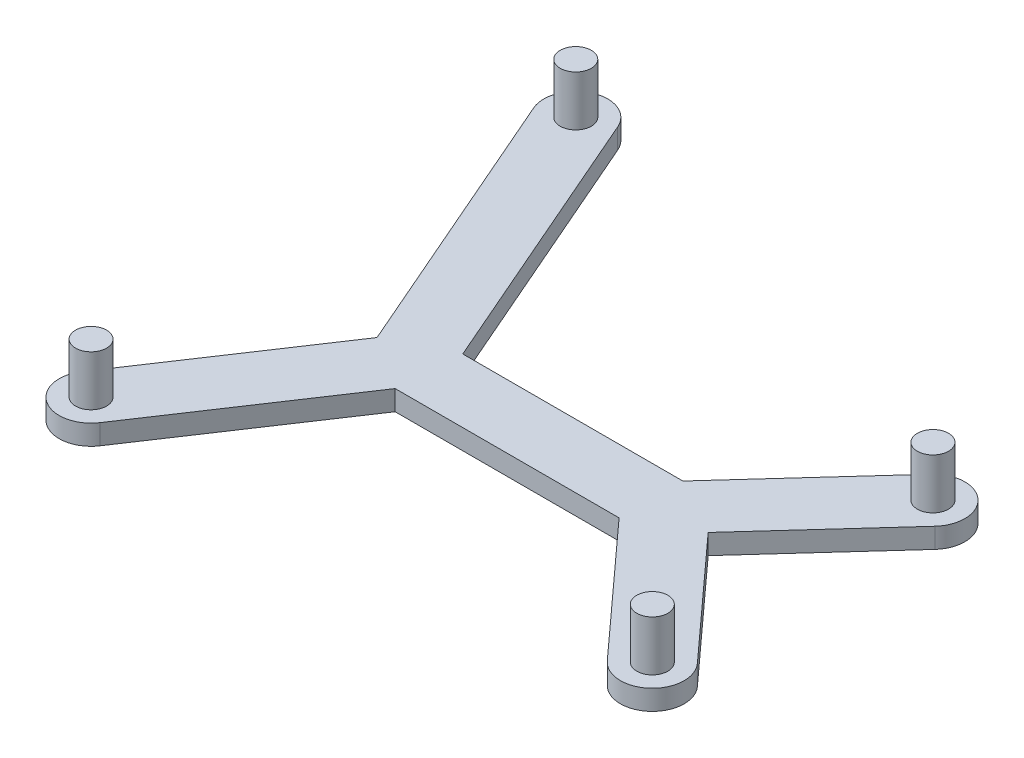
ISO-10303-21;
HEADER;
FILE_DESCRIPTION(('STEP AP214'),'2;1');
FILE_NAME('part.step','',(''),(''),'','','');
FILE_SCHEMA(('AUTOMOTIVE_DESIGN { 1 0 10303 214 1 1 1 1 }'));
ENDSEC;
DATA;
#1=APPLICATION_CONTEXT('core data for automotive mechanical design processes');
#2=APPLICATION_PROTOCOL_DEFINITION('international standard','automotive_design',2000,#1);
#3=PRODUCT_CONTEXT('',#1,'mechanical');
#4=PRODUCT('Part','Part','',(#3));
#5=PRODUCT_RELATED_PRODUCT_CATEGORY('part','',(#4));
#6=PRODUCT_DEFINITION_FORMATION('','',#4);
#7=PRODUCT_DEFINITION_CONTEXT('part definition',#1,'design');
#8=PRODUCT_DEFINITION('design','',#6,#7);
#9=PRODUCT_DEFINITION_SHAPE('','',#8);
#10=(LENGTH_UNIT() NAMED_UNIT(*) SI_UNIT(.MILLI.,.METRE.));
#11=(NAMED_UNIT(*) PLANE_ANGLE_UNIT() SI_UNIT($,.RADIAN.));
#12=(NAMED_UNIT(*) SI_UNIT($,.STERADIAN.) SOLID_ANGLE_UNIT());
#13=UNCERTAINTY_MEASURE_WITH_UNIT(LENGTH_MEASURE(1.E-05),#10,'distance_accuracy_value','');
#14=(GEOMETRIC_REPRESENTATION_CONTEXT(3) GLOBAL_UNCERTAINTY_ASSIGNED_CONTEXT((#13)) GLOBAL_UNIT_ASSIGNED_CONTEXT((#10,
#11,#12)) REPRESENTATION_CONTEXT('',''));
#15=CARTESIAN_POINT('',(0.,0.,0.));
#16=DIRECTION('',(0.,0.,1.));
#17=DIRECTION('',(1.,0.,0.));
#18=AXIS2_PLACEMENT_3D('',#15,#16,#17);
#19=CARTESIAN_POINT('',(11.0517762398185,-2.,-10.047069308926));
#20=DIRECTION('',(-0.739940073395943,0.,0.672672793996313));
#21=DIRECTION('',(0.672672793996313,0.,0.739940073395943));
#22=AXIS2_PLACEMENT_3D('',#19,#20,#21);
#23=PLANE('',#22);
#24=DIRECTION('',(0.672672793996313,0.,0.739940073395943));
#25=VECTOR('',#24,1.);
#26=CARTESIAN_POINT('',(11.0517762398185,0.,-10.047069308926));
#27=LINE('',#26,#25);
#28=CARTESIAN_POINT('',(51.9354756115694,0.,34.925));
#29=VERTEX_POINT('',#28);
#30=CARTESIAN_POINT('',(63.6906902669679,0.,47.8557361209383));
#31=VERTEX_POINT('',#30);
#32=EDGE_CURVE('E234',#29,#31,#27,.T.);
#33=ORIENTED_EDGE('',*,*,#32,.F.);
#34=DIRECTION('',(0.,1.,0.));
#35=VECTOR('',#34,1.);
#36=CARTESIAN_POINT('',(51.9354756115694,-2.,34.925));
#37=LINE('',#36,#35);
#38=CARTESIAN_POINT('',(51.9354756115694,-2.,34.925));
#39=VERTEX_POINT('',#38);
#40=EDGE_CURVE('E13',#39,#29,#37,.T.);
#41=ORIENTED_EDGE('',*,*,#40,.F.);
#42=DIRECTION('',(0.672672793996313,0.,0.739940073395943));
#43=VECTOR('',#42,1.);
#44=CARTESIAN_POINT('',(11.0517762398185,-2.,-10.047069308926));
#45=LINE('',#44,#43);
#46=CARTESIAN_POINT('',(63.6906902669679,-2.,47.8557361209383));
#47=VERTEX_POINT('',#46);
#48=EDGE_CURVE('E286',#39,#47,#45,.T.);
#49=ORIENTED_EDGE('',*,*,#48,.T.);
#50=DIRECTION('',(0.,1.,0.));
#51=VECTOR('',#50,1.);
#52=CARTESIAN_POINT('',(63.6906902669679,-2.,47.8557361209383));
#53=LINE('',#52,#51);
#54=EDGE_CURVE('E98',#47,#31,#53,.T.);
#55=ORIENTED_EDGE('',*,*,#54,.T.);
#56=EDGE_LOOP('',(#33,#41,#49,#55));
#57=FACE_BOUND('',#56,.T.);
#58=ADVANCED_FACE('F95',(#57),#23,.T.);
#59=CARTESIAN_POINT('',(0.,-2.,34.925));
#60=DIRECTION('',(0.,0.,1.));
#61=DIRECTION('',(1.,0.,0.));
#62=AXIS2_PLACEMENT_3D('',#59,#60,#61);
#63=PLANE('',#62);
#64=DIRECTION('',(1.,0.,0.));
#65=VECTOR('',#64,1.);
#66=CARTESIAN_POINT('',(0.,0.,34.925));
#67=LINE('',#66,#65);
#68=CARTESIAN_POINT('',(29.6392084331994,0.,34.925));
#69=VERTEX_POINT('',#68);
#70=EDGE_CURVE('E283',#69,#29,#67,.T.);
#71=ORIENTED_EDGE('',*,*,#70,.F.);
#72=DIRECTION('',(0.,1.,0.));
#73=VECTOR('',#72,1.);
#74=CARTESIAN_POINT('',(29.6392084331994,-2.,34.925));
#75=LINE('',#74,#73);
#76=CARTESIAN_POINT('',(29.6392084331994,-2.,34.925));
#77=VERTEX_POINT('',#76);
#78=EDGE_CURVE('E105',#77,#69,#75,.T.);
#79=ORIENTED_EDGE('',*,*,#78,.F.);
#80=DIRECTION('',(1.,0.,0.));
#81=VECTOR('',#80,1.);
#82=CARTESIAN_POINT('',(0.,-2.,34.925));
#83=LINE('',#82,#81);
#84=EDGE_CURVE('E211',#77,#39,#83,.T.);
#85=ORIENTED_EDGE('',*,*,#84,.T.);
#86=ORIENTED_EDGE('',*,*,#40,.T.);
#87=EDGE_LOOP('',(#71,#79,#85,#86));
#88=FACE_BOUND('',#87,.T.);
#89=ADVANCED_FACE('F326',(#88),#63,.T.);
#90=CARTESIAN_POINT('',(36.6386827614457,-2.,24.4257885076305));
#91=DIRECTION('',(-0.832050294337844,0.,-0.554700196225229));
#92=DIRECTION('',(-0.554700196225229,0.,0.832050294337844));
#93=AXIS2_PLACEMENT_3D('',#90,#91,#92);
#94=PLANE('',#93);
#95=DIRECTION('',(-0.554700196225229,0.,0.832050294337844));
#96=VECTOR('',#95,1.);
#97=CARTESIAN_POINT('',(36.6386827614457,0.,24.4257885076305));
#98=LINE('',#97,#96);
#99=CARTESIAN_POINT('',(17.8817596845227,0.,52.5611731230151));
#100=VERTEX_POINT('',#99);
#101=EDGE_CURVE('E216',#69,#100,#98,.T.);
#102=ORIENTED_EDGE('',*,*,#101,.T.);
#103=DIRECTION('',(0.,1.,0.));
#104=VECTOR('',#103,1.);
#105=CARTESIAN_POINT('',(17.8817596845227,-2.,52.5611731230151));
#106=LINE('',#105,#104);
#107=CARTESIAN_POINT('',(17.8817596845227,-2.,52.5611731230151));
#108=VERTEX_POINT('',#107);
#109=EDGE_CURVE('E214',#108,#100,#106,.T.);
#110=ORIENTED_EDGE('',*,*,#109,.F.);
#111=DIRECTION('',(-0.554700196225229,0.,0.832050294337844));
#112=VECTOR('',#111,1.);
#113=CARTESIAN_POINT('',(36.6386827614457,-2.,24.4257885076305));
#114=LINE('',#113,#112);
#115=EDGE_CURVE('E204',#77,#108,#114,.T.);
#116=ORIENTED_EDGE('',*,*,#115,.F.);
#117=ORIENTED_EDGE('',*,*,#78,.T.);
#118=EDGE_LOOP('',(#102,#110,#116,#117));
#119=FACE_BOUND('',#118,.T.);
#120=ADVANCED_FACE('F215',(#119),#94,.F.);
#121=CARTESIAN_POINT('',(15.24,-2.,50.8));
#122=DIRECTION('',(0.,1.,0.));
#123=DIRECTION('',(0.,0.,1.));
#124=AXIS2_PLACEMENT_3D('',#121,#122,#123);
#125=CYLINDRICAL_SURFACE('',#124,3.175);
#126=CARTESIAN_POINT('',(15.24,0.,50.8));
#127=DIRECTION('',(0.,1.,0.));
#128=DIRECTION('',(0.,0.,1.));
#129=AXIS2_PLACEMENT_3D('',#126,#127,#128);
#130=CIRCLE('',#129,3.175);
#131=CARTESIAN_POINT('',(12.5982403154774,0.,49.0388268769849));
#132=VERTEX_POINT('',#131);
#133=EDGE_CURVE('E278',#132,#100,#130,.T.);
#134=ORIENTED_EDGE('',*,*,#133,.F.);
#135=DIRECTION('',(0.,1.,0.));
#136=VECTOR('',#135,1.);
#137=CARTESIAN_POINT('',(12.5982403154774,-2.,49.0388268769849));
#138=LINE('',#137,#136);
#139=CARTESIAN_POINT('',(12.5982403154774,-2.,49.0388268769849));
#140=VERTEX_POINT('',#139);
#141=EDGE_CURVE('E221',#140,#132,#138,.T.);
#142=ORIENTED_EDGE('',*,*,#141,.F.);
#143=CARTESIAN_POINT('',(15.24,-2.,50.8));
#144=DIRECTION('',(0.,1.,0.));
#145=DIRECTION('',(0.,0.,1.));
#146=AXIS2_PLACEMENT_3D('',#143,#144,#145);
#147=CIRCLE('',#146,3.175);
#148=EDGE_CURVE('E209',#140,#108,#147,.T.);
#149=ORIENTED_EDGE('',*,*,#148,.T.);
#150=ORIENTED_EDGE('',*,*,#109,.T.);
#151=EDGE_LOOP('',(#134,#142,#149,#150));
#152=FACE_BOUND('',#151,.T.);
#153=ADVANCED_FACE('F223',(#152),#125,.T.);
#154=CARTESIAN_POINT('',(31.3551633924004,-2.,20.9034422616003));
#155=DIRECTION('',(-0.832050294337843,0.,-0.554700196225229));
#156=DIRECTION('',(-0.554700196225229,0.,0.832050294337844));
#157=AXIS2_PLACEMENT_3D('',#154,#155,#156);
#158=PLANE('',#157);
#159=DIRECTION('',(-0.554700196225229,0.,0.832050294337844));
#160=VECTOR('',#159,1.);
#161=CARTESIAN_POINT('',(31.3551633924004,0.,20.9034422616003));
#162=LINE('',#161,#160);
#163=CARTESIAN_POINT('',(24.3382441738607,0.,31.4288210894098));
#164=VERTEX_POINT('',#163);
#165=EDGE_CURVE('E274',#164,#132,#162,.T.);
#166=ORIENTED_EDGE('',*,*,#165,.F.);
#167=DIRECTION('',(0.,1.,0.));
#168=VECTOR('',#167,1.);
#169=CARTESIAN_POINT('',(24.3382441738607,-2.,31.4288210894098));
#170=LINE('',#169,#168);
#171=CARTESIAN_POINT('',(24.3382441738607,-2.,31.4288210894098));
#172=VERTEX_POINT('',#171);
#173=EDGE_CURVE('E292',#172,#164,#170,.T.);
#174=ORIENTED_EDGE('',*,*,#173,.F.);
#175=DIRECTION('',(-0.554700196225229,0.,0.832050294337844));
#176=VECTOR('',#175,1.);
#177=CARTESIAN_POINT('',(31.3551633924004,-2.,20.9034422616003));
#178=LINE('',#177,#176);
#179=EDGE_CURVE('E225',#172,#140,#178,.T.);
#180=ORIENTED_EDGE('',*,*,#179,.T.);
#181=ORIENTED_EDGE('',*,*,#141,.T.);
#182=EDGE_LOOP('',(#166,#174,#180,#181));
#183=FACE_BOUND('',#182,.T.);
#184=ADVANCED_FACE('F339',(#183),#158,.T.);
#185=CARTESIAN_POINT('',(8.97663325502078,-2.,-3.90288402392208));
#186=DIRECTION('',(-0.917070056253235,0.,0.39872611141445));
#187=DIRECTION('',(0.39872611141445,0.,0.917070056253235));
#188=AXIS2_PLACEMENT_3D('',#185,#186,#187);
#189=PLANE('',#188);
#190=DIRECTION('',(0.39872611141445,0.,0.917070056253235));
#191=VECTOR('',#190,1.);
#192=CARTESIAN_POINT('',(8.97663325502078,0.,-3.90288402392208));
#193=LINE('',#192,#191);
#194=CARTESIAN_POINT('',(12.328302571396,0.,3.80595540374088));
#195=VERTEX_POINT('',#194);
#196=EDGE_CURVE('E270',#195,#164,#193,.T.);
#197=ORIENTED_EDGE('',*,*,#196,.F.);
#198=DIRECTION('',(0.,1.,0.));
#199=VECTOR('',#198,1.);
#200=CARTESIAN_POINT('',(12.328302571396,-2.,3.80595540374088));
#201=LINE('',#200,#199);
#202=CARTESIAN_POINT('',(12.328302571396,-2.,3.80595540374088));
#203=VERTEX_POINT('',#202);
#204=EDGE_CURVE('E295',#203,#195,#201,.T.);
#205=ORIENTED_EDGE('',*,*,#204,.F.);
#206=DIRECTION('',(0.39872611141445,0.,0.917070056253235));
#207=VECTOR('',#206,1.);
#208=CARTESIAN_POINT('',(8.97663325502078,-2.,-3.90288402392208));
#209=LINE('',#208,#207);
#210=EDGE_CURVE('E228',#203,#172,#209,.T.);
#211=ORIENTED_EDGE('',*,*,#210,.T.);
#212=ORIENTED_EDGE('',*,*,#173,.T.);
#213=EDGE_LOOP('',(#197,#205,#211,#212));
#214=FACE_BOUND('',#213,.T.);
#215=ADVANCED_FACE('F342',(#214),#189,.T.);
#216=CARTESIAN_POINT('',(15.24,-2.,2.54));
#217=DIRECTION('',(0.,1.,0.));
#218=DIRECTION('',(0.,0.,1.));
#219=AXIS2_PLACEMENT_3D('',#216,#217,#218);
#220=CYLINDRICAL_SURFACE('',#219,3.175);
#221=CARTESIAN_POINT('',(15.24,0.,2.54));
#222=DIRECTION('',(0.,1.,0.));
#223=DIRECTION('',(0.,0.,1.));
#224=AXIS2_PLACEMENT_3D('',#221,#222,#223);
#225=CIRCLE('',#224,3.175);
#226=CARTESIAN_POINT('',(18.151697428604,0.,1.27404459625912));
#227=VERTEX_POINT('',#226);
#228=EDGE_CURVE('E266',#195,#227,#225,.F.);
#229=ORIENTED_EDGE('',*,*,#228,.T.);
#230=DIRECTION('',(0.,1.,0.));
#231=VECTOR('',#230,1.);
#232=CARTESIAN_POINT('',(18.151697428604,-2.,1.27404459625912));
#233=LINE('',#232,#231);
#234=CARTESIAN_POINT('',(18.151697428604,-2.,1.27404459625912));
#235=VERTEX_POINT('',#234);
#236=EDGE_CURVE('E298',#235,#227,#233,.T.);
#237=ORIENTED_EDGE('',*,*,#236,.F.);
#238=CARTESIAN_POINT('',(15.24,-2.,2.54));
#239=DIRECTION('',(0.,1.,0.));
#240=DIRECTION('',(0.,0.,1.));
#241=AXIS2_PLACEMENT_3D('',#238,#239,#240);
#242=CIRCLE('',#241,3.175);
#243=EDGE_CURVE('E500',#203,#235,#242,.F.);
#244=ORIENTED_EDGE('',*,*,#243,.F.);
#245=ORIENTED_EDGE('',*,*,#204,.T.);
#246=EDGE_LOOP('',(#229,#237,#244,#245));
#247=FACE_BOUND('',#246,.T.);
#248=ADVANCED_FACE('F346',(#247),#220,.T.);
#249=CARTESIAN_POINT('',(14.8000281122288,-2.,-6.43479483140384));
#250=DIRECTION('',(-0.917070056253235,0.,0.39872611141445));
#251=DIRECTION('',(0.39872611141445,0.,0.917070056253235));
#252=AXIS2_PLACEMENT_3D('',#249,#250,#251);
#253=PLANE('',#252);
#254=DIRECTION('',(0.39872611141445,0.,0.917070056253235));
#255=VECTOR('',#254,1.);
#256=CARTESIAN_POINT('',(14.8000281122288,0.,-6.43479483140384));
#257=LINE('',#256,#255);
#258=CARTESIAN_POINT('',(30.0216780389262,0.,28.575));
#259=VERTEX_POINT('',#258);
#260=EDGE_CURVE('E262',#227,#259,#257,.T.);
#261=ORIENTED_EDGE('',*,*,#260,.T.);
#262=DIRECTION('',(0.,1.,0.));
#263=VECTOR('',#262,1.);
#264=CARTESIAN_POINT('',(30.0216780389262,-2.,28.575));
#265=LINE('',#264,#263);
#266=CARTESIAN_POINT('',(30.0216780389262,-2.,28.575));
#267=VERTEX_POINT('',#266);
#268=EDGE_CURVE('E302',#267,#259,#265,.T.);
#269=ORIENTED_EDGE('',*,*,#268,.F.);
#270=DIRECTION('',(0.39872611141445,0.,0.917070056253235));
#271=VECTOR('',#270,1.);
#272=CARTESIAN_POINT('',(14.8000281122288,-2.,-6.43479483140384));
#273=LINE('',#272,#271);
#274=EDGE_CURVE('E503',#235,#267,#273,.T.);
#275=ORIENTED_EDGE('',*,*,#274,.F.);
#276=ORIENTED_EDGE('',*,*,#236,.T.);
#277=EDGE_LOOP('',(#261,#269,#275,#276));
#278=FACE_BOUND('',#277,.T.);
#279=ADVANCED_FACE('F350',(#278),#253,.F.);
#280=CARTESIAN_POINT('',(0.,-2.,28.575));
#281=DIRECTION('',(0.,0.,1.));
#282=DIRECTION('',(1.,0.,0.));
#283=AXIS2_PLACEMENT_3D('',#280,#281,#282);
#284=PLANE('',#283);
#285=DIRECTION('',(1.,0.,0.));
#286=VECTOR('',#285,1.);
#287=CARTESIAN_POINT('',(0.,0.,28.575));
#288=LINE('',#287,#286);
#289=CARTESIAN_POINT('',(51.9354756115695,0.,28.575));
#290=VERTEX_POINT('',#289);
#291=EDGE_CURVE('E258',#259,#290,#288,.T.);
#292=ORIENTED_EDGE('',*,*,#291,.T.);
#293=DIRECTION('',(0.,1.,0.));
#294=VECTOR('',#293,1.);
#295=CARTESIAN_POINT('',(51.9354756115695,-2.,28.575));
#296=LINE('',#295,#294);
#297=CARTESIAN_POINT('',(51.9354756115695,-2.,28.575));
#298=VERTEX_POINT('',#297);
#299=EDGE_CURVE('E306',#298,#290,#296,.T.);
#300=ORIENTED_EDGE('',*,*,#299,.F.);
#301=DIRECTION('',(1.,0.,0.));
#302=VECTOR('',#301,1.);
#303=CARTESIAN_POINT('',(0.,-2.,28.575));
#304=LINE('',#303,#302);
#305=EDGE_CURVE('E490',#267,#298,#304,.T.);
#306=ORIENTED_EDGE('',*,*,#305,.F.);
#307=ORIENTED_EDGE('',*,*,#268,.T.);
#308=EDGE_LOOP('',(#292,#300,#306,#307));
#309=FACE_BOUND('',#308,.T.);
#310=ADVANCED_FACE('F354',(#309),#284,.F.);
#311=CARTESIAN_POINT('',(42.6581110814475,-2.,38.7801009831341));
#312=DIRECTION('',(0.739940073395944,0.,0.672672793996313));
#313=DIRECTION('',(0.672672793996313,0.,-0.739940073395944));
#314=AXIS2_PLACEMENT_3D('',#311,#312,#313);
#315=PLANE('',#314);
#316=DIRECTION('',(0.672672793996313,0.,-0.739940073395944));
#317=VECTOR('',#316,1.);
#318=CARTESIAN_POINT('',(42.6581110814475,0.,38.7801009831341));
#319=LINE('',#318,#317);
#320=CARTESIAN_POINT('',(63.6906902669679,0.,15.6442638790617));
#321=VERTEX_POINT('',#320);
#322=EDGE_CURVE('E254',#290,#321,#319,.T.);
#323=ORIENTED_EDGE('',*,*,#322,.T.);
#324=DIRECTION('',(0.,1.,0.));
#325=VECTOR('',#324,1.);
#326=CARTESIAN_POINT('',(63.6906902669679,-2.,15.6442638790617));
#327=LINE('',#326,#325);
#328=CARTESIAN_POINT('',(63.6906902669679,-2.,15.6442638790617));
#329=VERTEX_POINT('',#328);
#330=EDGE_CURVE('E310',#329,#321,#327,.T.);
#331=ORIENTED_EDGE('',*,*,#330,.F.);
#332=DIRECTION('',(0.672672793996313,0.,-0.739940073395944));
#333=VECTOR('',#332,1.);
#334=CARTESIAN_POINT('',(42.6581110814475,-2.,38.7801009831341));
#335=LINE('',#334,#333);
#336=EDGE_CURVE('E487',#298,#329,#335,.T.);
#337=ORIENTED_EDGE('',*,*,#336,.F.);
#338=ORIENTED_EDGE('',*,*,#299,.T.);
#339=EDGE_LOOP('',(#323,#331,#337,#338));
#340=FACE_BOUND('',#339,.T.);
#341=ADVANCED_FACE('F358',(#340),#315,.F.);
#342=CARTESIAN_POINT('',(66.04,-2.,17.78));
#343=DIRECTION('',(0.,1.,0.));
#344=DIRECTION('',(0.,0.,1.));
#345=AXIS2_PLACEMENT_3D('',#342,#343,#344);
#346=CYLINDRICAL_SURFACE('',#345,3.175);
#347=CARTESIAN_POINT('',(66.04,0.,17.78));
#348=DIRECTION('',(0.,1.,0.));
#349=DIRECTION('',(0.,0.,1.));
#350=AXIS2_PLACEMENT_3D('',#347,#348,#349);
#351=CIRCLE('',#350,3.175);
#352=CARTESIAN_POINT('',(68.3893097330321,0.,19.9157361209383));
#353=VERTEX_POINT('',#352);
#354=EDGE_CURVE('E250',#353,#321,#351,.T.);
#355=ORIENTED_EDGE('',*,*,#354,.F.);
#356=DIRECTION('',(0.,1.,0.));
#357=VECTOR('',#356,1.);
#358=CARTESIAN_POINT('',(68.3893097330321,-2.,19.9157361209383));
#359=LINE('',#358,#357);
#360=CARTESIAN_POINT('',(68.3893097330321,-2.,19.9157361209383));
#361=VERTEX_POINT('',#360);
#362=EDGE_CURVE('E313',#361,#353,#359,.T.);
#363=ORIENTED_EDGE('',*,*,#362,.F.);
#364=CARTESIAN_POINT('',(66.04,-2.,17.78));
#365=DIRECTION('',(0.,1.,0.));
#366=DIRECTION('',(0.,0.,1.));
#367=AXIS2_PLACEMENT_3D('',#364,#365,#366);
#368=CIRCLE('',#367,3.175);
#369=EDGE_CURVE('E512',#361,#329,#368,.T.);
#370=ORIENTED_EDGE('',*,*,#369,.T.);
#371=ORIENTED_EDGE('',*,*,#330,.T.);
#372=EDGE_LOOP('',(#355,#363,#370,#371));
#373=FACE_BOUND('',#372,.T.);
#374=ADVANCED_FACE('F362',(#373),#346,.T.);
#375=CARTESIAN_POINT('',(47.3567305475118,-2.,43.0515732250107));
#376=DIRECTION('',(0.739940073395944,0.,0.672672793996312));
#377=DIRECTION('',(0.672672793996312,0.,-0.739940073395944));
#378=AXIS2_PLACEMENT_3D('',#375,#376,#377);
#379=PLANE('',#378);
#380=DIRECTION('',(0.672672793996312,0.,-0.739940073395944));
#381=VECTOR('',#380,1.);
#382=CARTESIAN_POINT('',(47.3567305475118,0.,43.0515732250107));
#383=LINE('',#382,#381);
#384=CARTESIAN_POINT('',(57.6308880247942,0.,31.75));
#385=VERTEX_POINT('',#384);
#386=EDGE_CURVE('E246',#385,#353,#383,.T.);
#387=ORIENTED_EDGE('',*,*,#386,.F.);
#388=DIRECTION('',(0.,1.,0.));
#389=VECTOR('',#388,1.);
#390=CARTESIAN_POINT('',(57.6308880247942,-2.,31.75));
#391=LINE('',#390,#389);
#392=CARTESIAN_POINT('',(57.6308880247942,-2.,31.75));
#393=VERTEX_POINT('',#392);
#394=EDGE_CURVE('E316',#393,#385,#391,.T.);
#395=ORIENTED_EDGE('',*,*,#394,.F.);
#396=DIRECTION('',(0.672672793996312,0.,-0.739940073395944));
#397=VECTOR('',#396,1.);
#398=CARTESIAN_POINT('',(47.3567305475118,-2.,43.0515732250107));
#399=LINE('',#398,#397);
#400=EDGE_CURVE('E482',#393,#361,#399,.T.);
#401=ORIENTED_EDGE('',*,*,#400,.T.);
#402=ORIENTED_EDGE('',*,*,#362,.T.);
#403=EDGE_LOOP('',(#387,#395,#401,#402));
#404=FACE_BOUND('',#403,.T.);
#405=ADVANCED_FACE('F366',(#404),#379,.T.);
#406=CARTESIAN_POINT('',(15.7503957058828,-2.,-14.3185415508026));
#407=DIRECTION('',(-0.739940073395944,0.,0.672672793996312));
#408=DIRECTION('',(0.672672793996312,0.,0.739940073395944));
#409=AXIS2_PLACEMENT_3D('',#406,#407,#408);
#410=PLANE('',#409);
#411=DIRECTION('',(0.672672793996312,0.,0.739940073395944));
#412=VECTOR('',#411,1.);
#413=CARTESIAN_POINT('',(15.7503957058828,0.,-14.3185415508026));
#414=LINE('',#413,#412);
#415=CARTESIAN_POINT('',(68.3893097330321,0.,43.5842638790617));
#416=VERTEX_POINT('',#415);
#417=EDGE_CURVE('E242',#385,#416,#414,.T.);
#418=ORIENTED_EDGE('',*,*,#417,.T.);
#419=DIRECTION('',(0.,1.,0.));
#420=VECTOR('',#419,1.);
#421=CARTESIAN_POINT('',(68.3893097330321,-2.,43.5842638790617));
#422=LINE('',#421,#420);
#423=CARTESIAN_POINT('',(68.3893097330321,-2.,43.5842638790617));
#424=VERTEX_POINT('',#423);
#425=EDGE_CURVE('E318',#424,#416,#422,.T.);
#426=ORIENTED_EDGE('',*,*,#425,.F.);
#427=DIRECTION('',(0.672672793996312,0.,0.739940073395944));
#428=VECTOR('',#427,1.);
#429=CARTESIAN_POINT('',(15.7503957058828,-2.,-14.3185415508026));
#430=LINE('',#429,#428);
#431=EDGE_CURVE('E517',#393,#424,#430,.T.);
#432=ORIENTED_EDGE('',*,*,#431,.F.);
#433=ORIENTED_EDGE('',*,*,#394,.T.);
#434=EDGE_LOOP('',(#418,#426,#432,#433));
#435=FACE_BOUND('',#434,.T.);
#436=ADVANCED_FACE('F370',(#435),#410,.F.);
#437=CARTESIAN_POINT('',(66.04,-2.,45.72));
#438=DIRECTION('',(0.,1.,0.));
#439=DIRECTION('',(0.,0.,1.));
#440=AXIS2_PLACEMENT_3D('',#437,#438,#439);
#441=CYLINDRICAL_SURFACE('',#440,3.175);
#442=CARTESIAN_POINT('',(66.04,0.,45.72));
#443=DIRECTION('',(0.,1.,0.));
#444=DIRECTION('',(0.,0.,1.));
#445=AXIS2_PLACEMENT_3D('',#442,#443,#444);
#446=CIRCLE('',#445,3.175);
#447=EDGE_CURVE('E238',#31,#416,#446,.T.);
#448=ORIENTED_EDGE('',*,*,#447,.F.);
#449=ORIENTED_EDGE('',*,*,#54,.F.);
#450=CARTESIAN_POINT('',(66.04,-2.,45.72));
#451=DIRECTION('',(0.,1.,0.));
#452=DIRECTION('',(0.,0.,1.));
#453=AXIS2_PLACEMENT_3D('',#450,#451,#452);
#454=CIRCLE('',#453,3.175);
#455=EDGE_CURVE('E520',#47,#424,#454,.T.);
#456=ORIENTED_EDGE('',*,*,#455,.T.);
#457=ORIENTED_EDGE('',*,*,#425,.T.);
#458=EDGE_LOOP('',(#448,#449,#456,#457));
#459=FACE_BOUND('',#458,.T.);
#460=ADVANCED_FACE('F322',(#459),#441,.T.);
#461=CARTESIAN_POINT('',(0.,-2.,0.));
#462=DIRECTION('',(0.,1.,0.));
#463=DIRECTION('',(0.,0.,1.));
#464=AXIS2_PLACEMENT_3D('',#461,#462,#463);
#465=PLANE('',#464);
#466=ORIENTED_EDGE('',*,*,#48,.F.);
#467=ORIENTED_EDGE('',*,*,#84,.F.);
#468=ORIENTED_EDGE('',*,*,#115,.T.);
#469=ORIENTED_EDGE('',*,*,#148,.F.);
#470=ORIENTED_EDGE('',*,*,#179,.F.);
#471=ORIENTED_EDGE('',*,*,#210,.F.);
#472=ORIENTED_EDGE('',*,*,#243,.T.);
#473=ORIENTED_EDGE('',*,*,#274,.T.);
#474=ORIENTED_EDGE('',*,*,#305,.T.);
#475=ORIENTED_EDGE('',*,*,#336,.T.);
#476=ORIENTED_EDGE('',*,*,#369,.F.);
#477=ORIENTED_EDGE('',*,*,#400,.F.);
#478=ORIENTED_EDGE('',*,*,#431,.T.);
#479=ORIENTED_EDGE('',*,*,#455,.F.);
#480=EDGE_LOOP('',(#466,#467,#468,#469,#470,#471,#472,#473,#474,#475,#476,#477,#478,#479));
#481=FACE_BOUND('',#480,.T.);
#482=ADVANCED_FACE('F206',(#481),#465,.F.);
#483=CARTESIAN_POINT('',(0.,0.,0.));
#484=DIRECTION('',(0.,1.,0.));
#485=DIRECTION('',(0.,0.,1.));
#486=AXIS2_PLACEMENT_3D('',#483,#484,#485);
#487=PLANE('',#486);
#488=ORIENTED_EDGE('',*,*,#32,.T.);
#489=ORIENTED_EDGE('',*,*,#447,.T.);
#490=ORIENTED_EDGE('',*,*,#417,.F.);
#491=ORIENTED_EDGE('',*,*,#386,.T.);
#492=ORIENTED_EDGE('',*,*,#354,.T.);
#493=ORIENTED_EDGE('',*,*,#322,.F.);
#494=ORIENTED_EDGE('',*,*,#291,.F.);
#495=ORIENTED_EDGE('',*,*,#260,.F.);
#496=ORIENTED_EDGE('',*,*,#228,.F.);
#497=ORIENTED_EDGE('',*,*,#196,.T.);
#498=ORIENTED_EDGE('',*,*,#165,.T.);
#499=ORIENTED_EDGE('',*,*,#133,.T.);
#500=ORIENTED_EDGE('',*,*,#101,.F.);
#501=ORIENTED_EDGE('',*,*,#70,.T.);
#502=EDGE_LOOP('',(#488,#489,#490,#491,#492,#493,#494,#495,#496,#497,#498,#499,#500,#501));
#503=FACE_BOUND('',#502,.T.);
#504=ADVANCED_FACE('F325',(#503),#487,.T.);
#505=CLOSED_SHELL('',(#58,#89,#120,#153,#184,#215,#248,#279,#310,#341,#374,#405,#436,#460,#482,#504));
#506=MANIFOLD_SOLID_BREP('B2',#505);
#507=CARTESIAN_POINT('',(15.24,5.,2.54));
#508=DIRECTION('',(0.,-1.,0.));
#509=DIRECTION('',(0.,0.,-1.));
#510=AXIS2_PLACEMENT_3D('',#507,#508,#509);
#511=CYLINDRICAL_SURFACE('',#510,1.55);
#512=CARTESIAN_POINT('',(15.24,5.,2.54));
#513=DIRECTION('',(0.,1.,0.));
#514=DIRECTION('',(0.,0.,1.));
#515=AXIS2_PLACEMENT_3D('',#512,#513,#514);
#516=CIRCLE('',#515,1.55);
#517=CARTESIAN_POINT('',(15.24,5.,4.09));
#518=VERTEX_POINT('',#517);
#519=EDGE_CURVE('E539',#518,#518,#516,.T.);
#520=ORIENTED_EDGE('',*,*,#519,.F.);
#521=EDGE_LOOP('',(#520));
#522=FACE_BOUND('',#521,.T.);
#523=CARTESIAN_POINT('',(15.24,0.,2.54));
#524=DIRECTION('',(0.,1.,0.));
#525=DIRECTION('',(0.,0.,1.));
#526=AXIS2_PLACEMENT_3D('',#523,#524,#525);
#527=CIRCLE('',#526,1.55);
#528=CARTESIAN_POINT('',(15.24,0.,4.09));
#529=VERTEX_POINT('',#528);
#530=EDGE_CURVE('E94',#529,#529,#527,.T.);
#531=ORIENTED_EDGE('',*,*,#530,.T.);
#532=EDGE_LOOP('',(#531));
#533=FACE_BOUND('',#532,.T.);
#534=ADVANCED_FACE('F535',(#522,#533),#511,.T.);
#535=CARTESIAN_POINT('',(15.24,5.,2.54));
#536=DIRECTION('',(0.,1.,0.));
#537=DIRECTION('',(0.,0.,1.));
#538=AXIS2_PLACEMENT_3D('',#535,#536,#537);
#539=PLANE('',#538);
#540=ORIENTED_EDGE('',*,*,#519,.T.);
#541=EDGE_LOOP('',(#540));
#542=FACE_BOUND('',#541,.T.);
#543=ADVANCED_FACE('F537',(#542),#539,.T.);
#544=CARTESIAN_POINT('',(15.24,0.,2.54));
#545=DIRECTION('',(0.,1.,0.));
#546=DIRECTION('',(0.,0.,1.));
#547=AXIS2_PLACEMENT_3D('',#544,#545,#546);
#548=PLANE('',#547);
#549=ORIENTED_EDGE('',*,*,#530,.F.);
#550=EDGE_LOOP('',(#549));
#551=FACE_BOUND('',#550,.T.);
#552=ADVANCED_FACE('F554',(#551),#548,.F.);
#553=CLOSED_SHELL('',(#534,#543,#552));
#554=MANIFOLD_SOLID_BREP('B7',#553);
#555=CARTESIAN_POINT('',(66.04,5.,17.78));
#556=DIRECTION('',(0.,-1.,0.));
#557=DIRECTION('',(0.,0.,-1.));
#558=AXIS2_PLACEMENT_3D('',#555,#556,#557);
#559=CYLINDRICAL_SURFACE('',#558,1.54999999999999);
#560=CARTESIAN_POINT('',(66.04,5.,17.78));
#561=DIRECTION('',(0.,1.,0.));
#562=DIRECTION('',(0.,0.,1.));
#563=AXIS2_PLACEMENT_3D('',#560,#561,#562);
#564=CIRCLE('',#563,1.54999999999999);
#565=CARTESIAN_POINT('',(66.04,5.,19.33));
#566=VERTEX_POINT('',#565);
#567=EDGE_CURVE('E588',#566,#566,#564,.T.);
#568=ORIENTED_EDGE('',*,*,#567,.F.);
#569=EDGE_LOOP('',(#568));
#570=FACE_BOUND('',#569,.T.);
#571=CARTESIAN_POINT('',(66.04,0.,17.78));
#572=DIRECTION('',(0.,1.,0.));
#573=DIRECTION('',(0.,0.,1.));
#574=AXIS2_PLACEMENT_3D('',#571,#572,#573);
#575=CIRCLE('',#574,1.54999999999999);
#576=CARTESIAN_POINT('',(66.04,0.,19.33));
#577=VERTEX_POINT('',#576);
#578=EDGE_CURVE('E534',#577,#577,#575,.T.);
#579=ORIENTED_EDGE('',*,*,#578,.T.);
#580=EDGE_LOOP('',(#579));
#581=FACE_BOUND('',#580,.T.);
#582=ADVANCED_FACE('F584',(#570,#581),#559,.T.);
#583=CARTESIAN_POINT('',(0.,5.,0.));
#584=DIRECTION('',(0.,1.,0.));
#585=DIRECTION('',(0.,0.,1.));
#586=AXIS2_PLACEMENT_3D('',#583,#584,#585);
#587=PLANE('',#586);
#588=ORIENTED_EDGE('',*,*,#567,.T.);
#589=EDGE_LOOP('',(#588));
#590=FACE_BOUND('',#589,.T.);
#591=ADVANCED_FACE('F586',(#590),#587,.T.);
#592=CARTESIAN_POINT('',(0.,0.,0.));
#593=DIRECTION('',(0.,1.,0.));
#594=DIRECTION('',(0.,0.,1.));
#595=AXIS2_PLACEMENT_3D('',#592,#593,#594);
#596=PLANE('',#595);
#597=ORIENTED_EDGE('',*,*,#578,.F.);
#598=EDGE_LOOP('',(#597));
#599=FACE_BOUND('',#598,.T.);
#600=ADVANCED_FACE('F603',(#599),#596,.F.);
#601=CLOSED_SHELL('',(#582,#591,#600));
#602=MANIFOLD_SOLID_BREP('B89',#601);
#603=CARTESIAN_POINT('',(66.04,5.,45.72));
#604=DIRECTION('',(0.,-1.,0.));
#605=DIRECTION('',(0.,0.,-1.));
#606=AXIS2_PLACEMENT_3D('',#603,#604,#605);
#607=CYLINDRICAL_SURFACE('',#606,1.54999999999999);
#608=CARTESIAN_POINT('',(66.04,5.,45.72));
#609=DIRECTION('',(0.,1.,0.));
#610=DIRECTION('',(0.,0.,1.));
#611=AXIS2_PLACEMENT_3D('',#608,#609,#610);
#612=CIRCLE('',#611,1.54999999999999);
#613=CARTESIAN_POINT('',(66.04,5.,47.27));
#614=VERTEX_POINT('',#613);
#615=EDGE_CURVE('E636',#614,#614,#612,.T.);
#616=ORIENTED_EDGE('',*,*,#615,.F.);
#617=EDGE_LOOP('',(#616));
#618=FACE_BOUND('',#617,.T.);
#619=CARTESIAN_POINT('',(66.04,0.,45.72));
#620=DIRECTION('',(0.,1.,0.));
#621=DIRECTION('',(0.,0.,1.));
#622=AXIS2_PLACEMENT_3D('',#619,#620,#621);
#623=CIRCLE('',#622,1.54999999999999);
#624=CARTESIAN_POINT('',(66.04,0.,47.27));
#625=VERTEX_POINT('',#624);
#626=EDGE_CURVE('E583',#625,#625,#623,.T.);
#627=ORIENTED_EDGE('',*,*,#626,.T.);
#628=EDGE_LOOP('',(#627));
#629=FACE_BOUND('',#628,.T.);
#630=ADVANCED_FACE('F632',(#618,#629),#607,.T.);
#631=CARTESIAN_POINT('',(0.,5.,0.));
#632=DIRECTION('',(0.,1.,0.));
#633=DIRECTION('',(0.,0.,1.));
#634=AXIS2_PLACEMENT_3D('',#631,#632,#633);
#635=PLANE('',#634);
#636=ORIENTED_EDGE('',*,*,#615,.T.);
#637=EDGE_LOOP('',(#636));
#638=FACE_BOUND('',#637,.T.);
#639=ADVANCED_FACE('F634',(#638),#635,.T.);
#640=CARTESIAN_POINT('',(0.,0.,0.));
#641=DIRECTION('',(0.,1.,0.));
#642=DIRECTION('',(0.,0.,1.));
#643=AXIS2_PLACEMENT_3D('',#640,#641,#642);
#644=PLANE('',#643);
#645=ORIENTED_EDGE('',*,*,#626,.F.);
#646=EDGE_LOOP('',(#645));
#647=FACE_BOUND('',#646,.T.);
#648=ADVANCED_FACE('F651',(#647),#644,.F.);
#649=CLOSED_SHELL('',(#630,#639,#648));
#650=MANIFOLD_SOLID_BREP('B529',#649);
#651=CARTESIAN_POINT('',(15.24,5.,50.8));
#652=DIRECTION('',(0.,-1.,0.));
#653=DIRECTION('',(0.,0.,-1.));
#654=AXIS2_PLACEMENT_3D('',#651,#652,#653);
#655=CYLINDRICAL_SURFACE('',#654,1.55);
#656=CARTESIAN_POINT('',(15.24,5.,50.8));
#657=DIRECTION('',(0.,1.,0.));
#658=DIRECTION('',(0.,0.,1.));
#659=AXIS2_PLACEMENT_3D('',#656,#657,#658);
#660=CIRCLE('',#659,1.55);
#661=CARTESIAN_POINT('',(15.24,5.,52.35));
#662=VERTEX_POINT('',#661);
#663=EDGE_CURVE('E631',#662,#662,#660,.T.);
#664=ORIENTED_EDGE('',*,*,#663,.F.);
#665=EDGE_LOOP('',(#664));
#666=FACE_BOUND('',#665,.T.);
#667=CARTESIAN_POINT('',(15.24,0.,50.8));
#668=DIRECTION('',(0.,1.,0.));
#669=DIRECTION('',(0.,0.,1.));
#670=AXIS2_PLACEMENT_3D('',#667,#668,#669);
#671=CIRCLE('',#670,1.55);
#672=CARTESIAN_POINT('',(15.24,0.,52.35));
#673=VERTEX_POINT('',#672);
#674=EDGE_CURVE('E676',#673,#673,#671,.T.);
#675=ORIENTED_EDGE('',*,*,#674,.T.);
#676=EDGE_LOOP('',(#675));
#677=FACE_BOUND('',#676,.T.);
#678=ADVANCED_FACE('F673',(#666,#677),#655,.T.);
#679=CARTESIAN_POINT('',(0.,5.,0.));
#680=DIRECTION('',(0.,1.,0.));
#681=DIRECTION('',(0.,0.,1.));
#682=AXIS2_PLACEMENT_3D('',#679,#680,#681);
#683=PLANE('',#682);
#684=ORIENTED_EDGE('',*,*,#663,.T.);
#685=EDGE_LOOP('',(#684));
#686=FACE_BOUND('',#685,.T.);
#687=ADVANCED_FACE('F688',(#686),#683,.T.);
#688=CARTESIAN_POINT('',(0.,0.,0.));
#689=DIRECTION('',(0.,1.,0.));
#690=DIRECTION('',(0.,0.,1.));
#691=AXIS2_PLACEMENT_3D('',#688,#689,#690);
#692=PLANE('',#691);
#693=ORIENTED_EDGE('',*,*,#674,.F.);
#694=EDGE_LOOP('',(#693));
#695=FACE_BOUND('',#694,.T.);
#696=ADVANCED_FACE('F686',(#695),#692,.F.);
#697=CLOSED_SHELL('',(#678,#687,#696));
#698=MANIFOLD_SOLID_BREP('B578',#697);
#699=ADVANCED_BREP_SHAPE_REPRESENTATION('',(#18,#506,#554,#602,#650,#698),#14);
#700=SHAPE_DEFINITION_REPRESENTATION(#9,#699);
ENDSEC;
END-ISO-10303-21;
